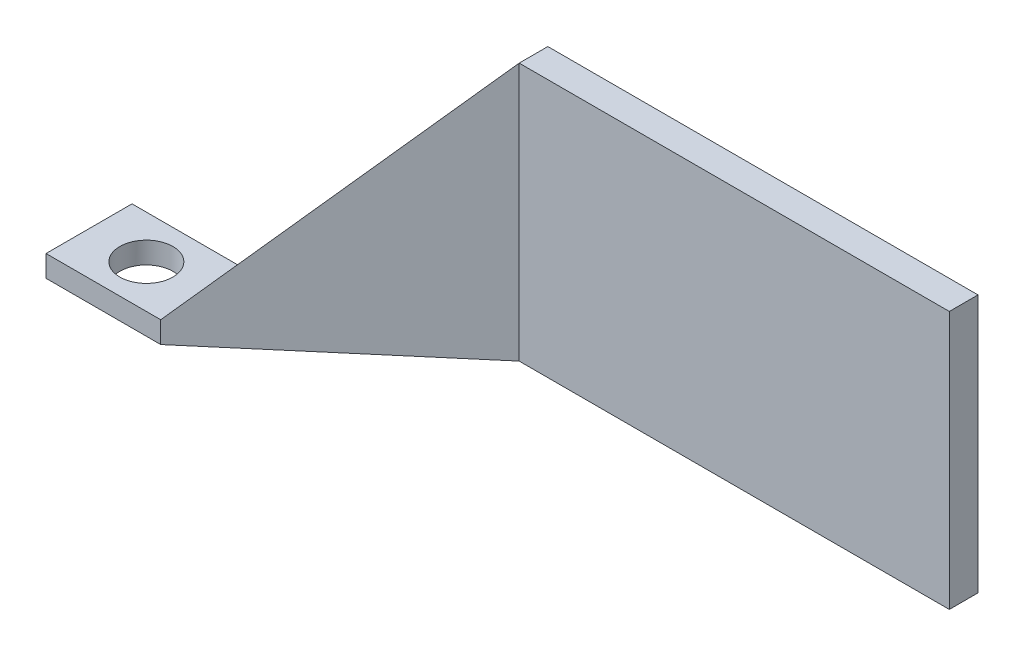
ISO-10303-21;
HEADER;
FILE_DESCRIPTION(('STEP AP214'),'2;1');
FILE_NAME('part.step','',(''),(''),'','','');
FILE_SCHEMA(('AUTOMOTIVE_DESIGN { 1 0 10303 214 1 1 1 1 }'));
ENDSEC;
DATA;
#1=APPLICATION_CONTEXT('core data for automotive mechanical design processes');
#2=APPLICATION_PROTOCOL_DEFINITION('international standard','automotive_design',2000,#1);
#3=PRODUCT_CONTEXT('',#1,'mechanical');
#4=PRODUCT('Part','Part','',(#3));
#5=PRODUCT_RELATED_PRODUCT_CATEGORY('part','',(#4));
#6=PRODUCT_DEFINITION_FORMATION('','',#4);
#7=PRODUCT_DEFINITION_CONTEXT('part definition',#1,'design');
#8=PRODUCT_DEFINITION('design','',#6,#7);
#9=PRODUCT_DEFINITION_SHAPE('','',#8);
#10=(LENGTH_UNIT() NAMED_UNIT(*) SI_UNIT(.MILLI.,.METRE.));
#11=(NAMED_UNIT(*) PLANE_ANGLE_UNIT() SI_UNIT($,.RADIAN.));
#12=(NAMED_UNIT(*) SI_UNIT($,.STERADIAN.) SOLID_ANGLE_UNIT());
#13=UNCERTAINTY_MEASURE_WITH_UNIT(LENGTH_MEASURE(1.E-05),#10,'distance_accuracy_value','');
#14=(GEOMETRIC_REPRESENTATION_CONTEXT(3) GLOBAL_UNCERTAINTY_ASSIGNED_CONTEXT((#13)) GLOBAL_UNIT_ASSIGNED_CONTEXT((#10,
#11,#12)) REPRESENTATION_CONTEXT('',''));
#15=CARTESIAN_POINT('',(0.,0.,0.));
#16=DIRECTION('',(0.,0.,1.));
#17=DIRECTION('',(1.,0.,0.));
#18=AXIS2_PLACEMENT_3D('',#15,#16,#17);
#19=CARTESIAN_POINT('',(0.,0.,6.));
#20=DIRECTION('',(0.,-1.,0.));
#21=DIRECTION('',(1.,0.,0.));
#22=AXIS2_PLACEMENT_3D('',#19,#20,#21);
#23=PLANE('',#22);
#24=CARTESIAN_POINT('',(-4.,0.,3.));
#25=DIRECTION('',(0.,1.,0.));
#26=DIRECTION('',(0.,0.,1.));
#27=AXIS2_PLACEMENT_3D('',#24,#25,#26);
#28=CIRCLE('',#27,1.85);
#29=CARTESIAN_POINT('',(-4.,0.,4.85));
#30=VERTEX_POINT('',#29);
#31=EDGE_CURVE('E159',#30,#30,#28,.T.);
#32=ORIENTED_EDGE('',*,*,#31,.F.);
#33=EDGE_LOOP('',(#32));
#34=FACE_BOUND('',#33,.T.);
#35=DIRECTION('',(-1.,0.,0.));
#36=VECTOR('',#35,1.);
#37=CARTESIAN_POINT('',(0.,0.,0.));
#38=LINE('',#37,#36);
#39=CARTESIAN_POINT('',(0.,0.,0.));
#40=VERTEX_POINT('',#39);
#41=CARTESIAN_POINT('',(-8.,0.,0.));
#42=VERTEX_POINT('',#41);
#43=EDGE_CURVE('E268',#40,#42,#38,.T.);
#44=ORIENTED_EDGE('',*,*,#43,.T.);
#45=DIRECTION('',(0.,0.,-1.));
#46=VECTOR('',#45,1.);
#47=CARTESIAN_POINT('',(-8.,0.,6.));
#48=LINE('',#47,#46);
#49=CARTESIAN_POINT('',(-8.,0.,6.));
#50=VERTEX_POINT('',#49);
#51=EDGE_CURVE('E63',#50,#42,#48,.T.);
#52=ORIENTED_EDGE('',*,*,#51,.F.);
#53=DIRECTION('',(-1.,0.,0.));
#54=VECTOR('',#53,1.);
#55=CARTESIAN_POINT('',(0.,0.,6.));
#56=LINE('',#55,#54);
#57=CARTESIAN_POINT('',(0.,0.,6.));
#58=VERTEX_POINT('',#57);
#59=EDGE_CURVE('E85',#58,#50,#56,.T.);
#60=ORIENTED_EDGE('',*,*,#59,.F.);
#61=DIRECTION('',(0.,0.,1.));
#62=VECTOR('',#61,1.);
#63=CARTESIAN_POINT('',(0.,0.,6.));
#64=LINE('',#63,#62);
#65=EDGE_CURVE('E12',#58,#40,#64,.F.);
#66=ORIENTED_EDGE('',*,*,#65,.T.);
#67=EDGE_LOOP('',(#44,#52,#60,#66));
#68=FACE_BOUND('',#67,.T.);
#69=ADVANCED_FACE('F53',(#34,#68),#23,.F.);
#70=CARTESIAN_POINT('',(-8.,0.,6.));
#71=DIRECTION('',(1.,0.,0.));
#72=DIRECTION('',(0.,0.,-1.));
#73=AXIS2_PLACEMENT_3D('',#70,#71,#72);
#74=PLANE('',#73);
#75=DIRECTION('',(0.,-1.,0.));
#76=VECTOR('',#75,1.);
#77=CARTESIAN_POINT('',(-8.,0.,0.));
#78=LINE('',#77,#76);
#79=CARTESIAN_POINT('',(-8.,-1.5,0.));
#80=VERTEX_POINT('',#79);
#81=EDGE_CURVE('E93',#42,#80,#78,.T.);
#82=ORIENTED_EDGE('',*,*,#81,.T.);
#83=DIRECTION('',(0.,0.,-1.));
#84=VECTOR('',#83,1.);
#85=CARTESIAN_POINT('',(-8.,-1.5,6.));
#86=LINE('',#85,#84);
#87=CARTESIAN_POINT('',(-8.,-1.5,6.));
#88=VERTEX_POINT('',#87);
#89=EDGE_CURVE('E279',#88,#80,#86,.T.);
#90=ORIENTED_EDGE('',*,*,#89,.F.);
#91=DIRECTION('',(0.,-1.,0.));
#92=VECTOR('',#91,1.);
#93=CARTESIAN_POINT('',(-8.,0.,6.));
#94=LINE('',#93,#92);
#95=EDGE_CURVE('E277',#50,#88,#94,.T.);
#96=ORIENTED_EDGE('',*,*,#95,.F.);
#97=ORIENTED_EDGE('',*,*,#51,.T.);
#98=EDGE_LOOP('',(#82,#90,#96,#97));
#99=FACE_BOUND('',#98,.T.);
#100=ADVANCED_FACE('F258',(#99),#74,.F.);
#101=CARTESIAN_POINT('',(-8.,-1.5,6.));
#102=DIRECTION('',(0.,1.,0.));
#103=DIRECTION('',(-1.,0.,0.));
#104=AXIS2_PLACEMENT_3D('',#101,#102,#103);
#105=PLANE('',#104);
#106=CARTESIAN_POINT('',(-4.,-1.5,3.));
#107=DIRECTION('',(0.,1.,0.));
#108=DIRECTION('',(-1.,0.,0.));
#109=AXIS2_PLACEMENT_3D('',#106,#107,#108);
#110=CIRCLE('',#109,1.85);
#111=CARTESIAN_POINT('',(-5.85,-1.5,3.));
#112=VERTEX_POINT('',#111);
#113=EDGE_CURVE('E56',#112,#112,#110,.T.);
#114=ORIENTED_EDGE('',*,*,#113,.T.);
#115=EDGE_LOOP('',(#114));
#116=FACE_BOUND('',#115,.T.);
#117=DIRECTION('',(1.,0.,0.));
#118=VECTOR('',#117,1.);
#119=CARTESIAN_POINT('',(-8.,-1.5,0.));
#120=LINE('',#119,#118);
#121=CARTESIAN_POINT('',(0.,-1.5,0.));
#122=VERTEX_POINT('',#121);
#123=EDGE_CURVE('E283',#80,#122,#120,.T.);
#124=ORIENTED_EDGE('',*,*,#123,.T.);
#125=DIRECTION('',(0.,0.,1.));
#126=VECTOR('',#125,1.);
#127=CARTESIAN_POINT('',(0.,-1.5,0.));
#128=LINE('',#127,#126);
#129=CARTESIAN_POINT('',(0.,-1.5,6.));
#130=VERTEX_POINT('',#129);
#131=EDGE_CURVE('E293',#130,#122,#128,.F.);
#132=ORIENTED_EDGE('',*,*,#131,.F.);
#133=DIRECTION('',(1.,0.,0.));
#134=VECTOR('',#133,1.);
#135=CARTESIAN_POINT('',(-8.,-1.5,6.));
#136=LINE('',#135,#134);
#137=EDGE_CURVE('E72',#88,#130,#136,.T.);
#138=ORIENTED_EDGE('',*,*,#137,.F.);
#139=ORIENTED_EDGE('',*,*,#89,.T.);
#140=EDGE_LOOP('',(#124,#132,#138,#139));
#141=FACE_BOUND('',#140,.T.);
#142=ADVANCED_FACE('F264',(#116,#141),#105,.F.);
#143=CARTESIAN_POINT('',(0.,0.,6.));
#144=DIRECTION('',(0.,0.,1.));
#145=DIRECTION('',(1.,0.,0.));
#146=AXIS2_PLACEMENT_3D('',#143,#144,#145);
#147=PLANE('',#146);
#148=DIRECTION('',(0.,1.,0.));
#149=VECTOR('',#148,1.);
#150=CARTESIAN_POINT('',(0.,0.,6.));
#151=LINE('',#150,#149);
#152=EDGE_CURVE('E287',#130,#58,#151,.T.);
#153=ORIENTED_EDGE('',*,*,#152,.T.);
#154=ORIENTED_EDGE('',*,*,#59,.T.);
#155=ORIENTED_EDGE('',*,*,#95,.T.);
#156=ORIENTED_EDGE('',*,*,#137,.T.);
#157=EDGE_LOOP('',(#153,#154,#155,#156));
#158=FACE_BOUND('',#157,.T.);
#159=ADVANCED_FACE('F375',(#158),#147,.T.);
#160=CARTESIAN_POINT('',(0.,0.,0.));
#161=DIRECTION('',(0.,0.,1.));
#162=DIRECTION('',(1.,0.,0.));
#163=AXIS2_PLACEMENT_3D('',#160,#161,#162);
#164=PLANE('',#163);
#165=DIRECTION('',(0.,1.,0.));
#166=VECTOR('',#165,1.);
#167=CARTESIAN_POINT('',(0.,0.,0.));
#168=LINE('',#167,#166);
#169=EDGE_CURVE('E275',#122,#40,#168,.T.);
#170=ORIENTED_EDGE('',*,*,#169,.F.);
#171=ORIENTED_EDGE('',*,*,#123,.F.);
#172=ORIENTED_EDGE('',*,*,#81,.F.);
#173=ORIENTED_EDGE('',*,*,#43,.F.);
#174=EDGE_LOOP('',(#170,#171,#172,#173));
#175=FACE_BOUND('',#174,.T.);
#176=ADVANCED_FACE('F190',(#175),#164,.F.);
#177=CARTESIAN_POINT('',(0.,0.,0.));
#178=DIRECTION('',(-0.371390676354104,0.,-0.928476690885259));
#179=DIRECTION('',(-0.928476690885259,0.,0.371390676354104));
#180=AXIS2_PLACEMENT_3D('',#177,#178,#179);
#181=PLANE('',#180);
#182=DIRECTION('',(-0.924500327042049,-0.0924500327042049,0.36980013081682));
#183=VECTOR('',#182,1.);
#184=CARTESIAN_POINT('',(15.,0.,-6.));
#185=LINE('',#184,#183);
#186=CARTESIAN_POINT('',(15.,0.,-6.));
#187=VERTEX_POINT('',#186);
#188=EDGE_CURVE('E219',#187,#122,#185,.T.);
#189=ORIENTED_EDGE('',*,*,#188,.T.);
#190=ORIENTED_EDGE('',*,*,#169,.T.);
#191=DIRECTION('',(-0.620173672946042,-0.744208407535251,0.248069469178417));
#192=VECTOR('',#191,1.);
#193=CARTESIAN_POINT('',(15.,18.,-6.));
#194=LINE('',#193,#192);
#195=CARTESIAN_POINT('',(15.,18.,-6.));
#196=VERTEX_POINT('',#195);
#197=EDGE_CURVE('E177',#196,#40,#194,.T.);
#198=ORIENTED_EDGE('',*,*,#197,.F.);
#199=DIRECTION('',(0.,-1.,0.));
#200=VECTOR('',#199,1.);
#201=CARTESIAN_POINT('',(15.,18.,-6.));
#202=LINE('',#201,#200);
#203=EDGE_CURVE('E171',#196,#187,#202,.T.);
#204=ORIENTED_EDGE('',*,*,#203,.T.);
#205=EDGE_LOOP('',(#189,#190,#198,#204));
#206=FACE_BOUND('',#205,.T.);
#207=ADVANCED_FACE('F179',(#206),#181,.T.);
#208=CARTESIAN_POINT('',(0.,0.,0.));
#209=DIRECTION('',(0.768221279597376,-0.64018439966448,0.));
#210=DIRECTION('',(0.64018439966448,0.768221279597376,0.));
#211=AXIS2_PLACEMENT_3D('',#208,#209,#210);
#212=PLANE('',#211);
#213=ORIENTED_EDGE('',*,*,#197,.T.);
#214=ORIENTED_EDGE('',*,*,#65,.F.);
#215=DIRECTION('',(-0.588801503984144,-0.706561804780974,0.39253433598943));
#216=VECTOR('',#215,1.);
#217=CARTESIAN_POINT('',(15.,18.,-4.));
#218=LINE('',#217,#216);
#219=CARTESIAN_POINT('',(15.,18.,-4.));
#220=VERTEX_POINT('',#219);
#221=EDGE_CURVE('E301',#220,#58,#218,.T.);
#222=ORIENTED_EDGE('',*,*,#221,.F.);
#223=DIRECTION('',(0.,0.,1.));
#224=VECTOR('',#223,1.);
#225=CARTESIAN_POINT('',(15.,18.,-6.));
#226=LINE('',#225,#224);
#227=EDGE_CURVE('E131',#196,#220,#226,.T.);
#228=ORIENTED_EDGE('',*,*,#227,.F.);
#229=EDGE_LOOP('',(#213,#214,#222,#228));
#230=FACE_BOUND('',#229,.T.);
#231=ADVANCED_FACE('F189',(#230),#212,.F.);
#232=CARTESIAN_POINT('',(0.148514851485149,-1.48514851485149,0.));
#233=DIRECTION('',(0.099503719020999,-0.995037190209989,0.));
#234=DIRECTION('',(0.995037190209989,0.099503719020999,0.));
#235=AXIS2_PLACEMENT_3D('',#232,#233,#234);
#236=PLANE('',#235);
#237=DIRECTION('',(-0.829184989234173,-0.0829184989234174,0.552789992822782));
#238=VECTOR('',#237,1.);
#239=CARTESIAN_POINT('',(15.,0.,-4.));
#240=LINE('',#239,#238);
#241=CARTESIAN_POINT('',(15.,0.,-4.));
#242=VERTEX_POINT('',#241);
#243=EDGE_CURVE('E343',#242,#130,#240,.T.);
#244=ORIENTED_EDGE('',*,*,#243,.T.);
#245=ORIENTED_EDGE('',*,*,#131,.T.);
#246=ORIENTED_EDGE('',*,*,#188,.F.);
#247=DIRECTION('',(0.,0.,1.));
#248=VECTOR('',#247,1.);
#249=CARTESIAN_POINT('',(15.,0.,-6.));
#250=LINE('',#249,#248);
#251=EDGE_CURVE('E146',#187,#242,#250,.T.);
#252=ORIENTED_EDGE('',*,*,#251,.T.);
#253=EDGE_LOOP('',(#244,#245,#246,#252));
#254=FACE_BOUND('',#253,.T.);
#255=ADVANCED_FACE('F196',(#254),#236,.T.);
#256=CARTESIAN_POINT('',(2.76923076923077,0.,4.15384615384615));
#257=DIRECTION('',(-0.554700196225229,0.,-0.832050294337844));
#258=DIRECTION('',(-0.832050294337844,0.,0.554700196225229));
#259=AXIS2_PLACEMENT_3D('',#256,#257,#258);
#260=PLANE('',#259);
#261=ORIENTED_EDGE('',*,*,#221,.T.);
#262=ORIENTED_EDGE('',*,*,#152,.F.);
#263=ORIENTED_EDGE('',*,*,#243,.F.);
#264=DIRECTION('',(0.,-1.,0.));
#265=VECTOR('',#264,1.);
#266=CARTESIAN_POINT('',(15.,18.,-4.));
#267=LINE('',#266,#265);
#268=EDGE_CURVE('E312',#220,#242,#267,.T.);
#269=ORIENTED_EDGE('',*,*,#268,.F.);
#270=EDGE_LOOP('',(#261,#262,#263,#269));
#271=FACE_BOUND('',#270,.T.);
#272=ADVANCED_FACE('F256',(#271),#260,.F.);
#273=CARTESIAN_POINT('',(15.,18.,-4.));
#274=DIRECTION('',(0.,0.,-1.));
#275=DIRECTION('',(-1.,0.,0.));
#276=AXIS2_PLACEMENT_3D('',#273,#274,#275);
#277=PLANE('',#276);
#278=DIRECTION('',(1.,0.,0.));
#279=VECTOR('',#278,1.);
#280=CARTESIAN_POINT('',(15.,0.,-4.));
#281=LINE('',#280,#279);
#282=CARTESIAN_POINT('',(45.,0.,-4.));
#283=VERTEX_POINT('',#282);
#284=EDGE_CURVE('E142',#242,#283,#281,.T.);
#285=ORIENTED_EDGE('',*,*,#284,.T.);
#286=DIRECTION('',(0.,-1.,0.));
#287=VECTOR('',#286,1.);
#288=CARTESIAN_POINT('',(45.,18.,-4.));
#289=LINE('',#288,#287);
#290=CARTESIAN_POINT('',(45.,18.,-4.));
#291=VERTEX_POINT('',#290);
#292=EDGE_CURVE('E139',#291,#283,#289,.T.);
#293=ORIENTED_EDGE('',*,*,#292,.F.);
#294=DIRECTION('',(1.,0.,0.));
#295=VECTOR('',#294,1.);
#296=CARTESIAN_POINT('',(15.,18.,-4.));
#297=LINE('',#296,#295);
#298=EDGE_CURVE('E124',#220,#291,#297,.T.);
#299=ORIENTED_EDGE('',*,*,#298,.F.);
#300=ORIENTED_EDGE('',*,*,#268,.T.);
#301=EDGE_LOOP('',(#285,#293,#299,#300));
#302=FACE_BOUND('',#301,.T.);
#303=ADVANCED_FACE('F140',(#302),#277,.F.);
#304=CARTESIAN_POINT('',(45.,18.,-6.));
#305=DIRECTION('',(-1.,0.,0.));
#306=DIRECTION('',(0.,0.,1.));
#307=AXIS2_PLACEMENT_3D('',#304,#305,#306);
#308=PLANE('',#307);
#309=DIRECTION('',(0.,0.,-1.));
#310=VECTOR('',#309,1.);
#311=CARTESIAN_POINT('',(45.,0.,-6.));
#312=LINE('',#311,#310);
#313=CARTESIAN_POINT('',(45.,0.,-6.));
#314=VERTEX_POINT('',#313);
#315=EDGE_CURVE('E160',#283,#314,#312,.T.);
#316=ORIENTED_EDGE('',*,*,#315,.T.);
#317=DIRECTION('',(0.,-1.,0.));
#318=VECTOR('',#317,1.);
#319=CARTESIAN_POINT('',(45.,18.,-6.));
#320=LINE('',#319,#318);
#321=CARTESIAN_POINT('',(45.,18.,-6.));
#322=VERTEX_POINT('',#321);
#323=EDGE_CURVE('E147',#322,#314,#320,.T.);
#324=ORIENTED_EDGE('',*,*,#323,.F.);
#325=DIRECTION('',(0.,0.,-1.));
#326=VECTOR('',#325,1.);
#327=CARTESIAN_POINT('',(45.,18.,-6.));
#328=LINE('',#327,#326);
#329=EDGE_CURVE('E129',#291,#322,#328,.T.);
#330=ORIENTED_EDGE('',*,*,#329,.F.);
#331=ORIENTED_EDGE('',*,*,#292,.T.);
#332=EDGE_LOOP('',(#316,#324,#330,#331));
#333=FACE_BOUND('',#332,.T.);
#334=ADVANCED_FACE('F149',(#333),#308,.F.);
#335=CARTESIAN_POINT('',(15.,18.,-6.));
#336=DIRECTION('',(0.,0.,1.));
#337=DIRECTION('',(1.,0.,0.));
#338=AXIS2_PLACEMENT_3D('',#335,#336,#337);
#339=PLANE('',#338);
#340=DIRECTION('',(-1.,0.,0.));
#341=VECTOR('',#340,1.);
#342=CARTESIAN_POINT('',(15.,0.,-6.));
#343=LINE('',#342,#341);
#344=EDGE_CURVE('E136',#314,#187,#343,.T.);
#345=ORIENTED_EDGE('',*,*,#344,.T.);
#346=ORIENTED_EDGE('',*,*,#203,.F.);
#347=DIRECTION('',(-1.,0.,0.));
#348=VECTOR('',#347,1.);
#349=CARTESIAN_POINT('',(15.,18.,-6.));
#350=LINE('',#349,#348);
#351=EDGE_CURVE('E153',#322,#196,#350,.T.);
#352=ORIENTED_EDGE('',*,*,#351,.F.);
#353=ORIENTED_EDGE('',*,*,#323,.T.);
#354=EDGE_LOOP('',(#345,#346,#352,#353));
#355=FACE_BOUND('',#354,.T.);
#356=ADVANCED_FACE('F248',(#355),#339,.F.);
#357=CARTESIAN_POINT('',(0.,18.,0.));
#358=DIRECTION('',(0.,1.,0.));
#359=DIRECTION('',(0.,0.,1.));
#360=AXIS2_PLACEMENT_3D('',#357,#358,#359);
#361=PLANE('',#360);
#362=ORIENTED_EDGE('',*,*,#227,.T.);
#363=ORIENTED_EDGE('',*,*,#298,.T.);
#364=ORIENTED_EDGE('',*,*,#329,.T.);
#365=ORIENTED_EDGE('',*,*,#351,.T.);
#366=EDGE_LOOP('',(#362,#363,#364,#365));
#367=FACE_BOUND('',#366,.T.);
#368=ADVANCED_FACE('F126',(#367),#361,.T.);
#369=CARTESIAN_POINT('',(0.,0.,0.));
#370=DIRECTION('',(0.,1.,0.));
#371=DIRECTION('',(0.,0.,1.));
#372=AXIS2_PLACEMENT_3D('',#369,#370,#371);
#373=PLANE('',#372);
#374=ORIENTED_EDGE('',*,*,#251,.F.);
#375=ORIENTED_EDGE('',*,*,#344,.F.);
#376=ORIENTED_EDGE('',*,*,#315,.F.);
#377=ORIENTED_EDGE('',*,*,#284,.F.);
#378=EDGE_LOOP('',(#374,#375,#376,#377));
#379=FACE_BOUND('',#378,.T.);
#380=ADVANCED_FACE('F236',(#379),#373,.F.);
#381=CARTESIAN_POINT('',(-4.,-6.,3.));
#382=DIRECTION('',(0.,1.,0.));
#383=DIRECTION('',(0.,0.,1.));
#384=AXIS2_PLACEMENT_3D('',#381,#382,#383);
#385=CYLINDRICAL_SURFACE('',#384,1.85);
#386=ORIENTED_EDGE('',*,*,#31,.T.);
#387=EDGE_LOOP('',(#386));
#388=FACE_BOUND('',#387,.T.);
#389=ORIENTED_EDGE('',*,*,#113,.F.);
#390=EDGE_LOOP('',(#389));
#391=FACE_BOUND('',#390,.T.);
#392=ADVANCED_FACE('F245',(#388,#391),#385,.F.);
#393=CLOSED_SHELL('',(#69,#100,#142,#159,#176,#207,#231,#255,#272,#303,#334,#356,#368,#380,#392));
#394=MANIFOLD_SOLID_BREP('B2',#393);
#395=ADVANCED_BREP_SHAPE_REPRESENTATION('',(#18,#394),#14);
#396=SHAPE_DEFINITION_REPRESENTATION(#9,#395);
ENDSEC;
END-ISO-10303-21;
